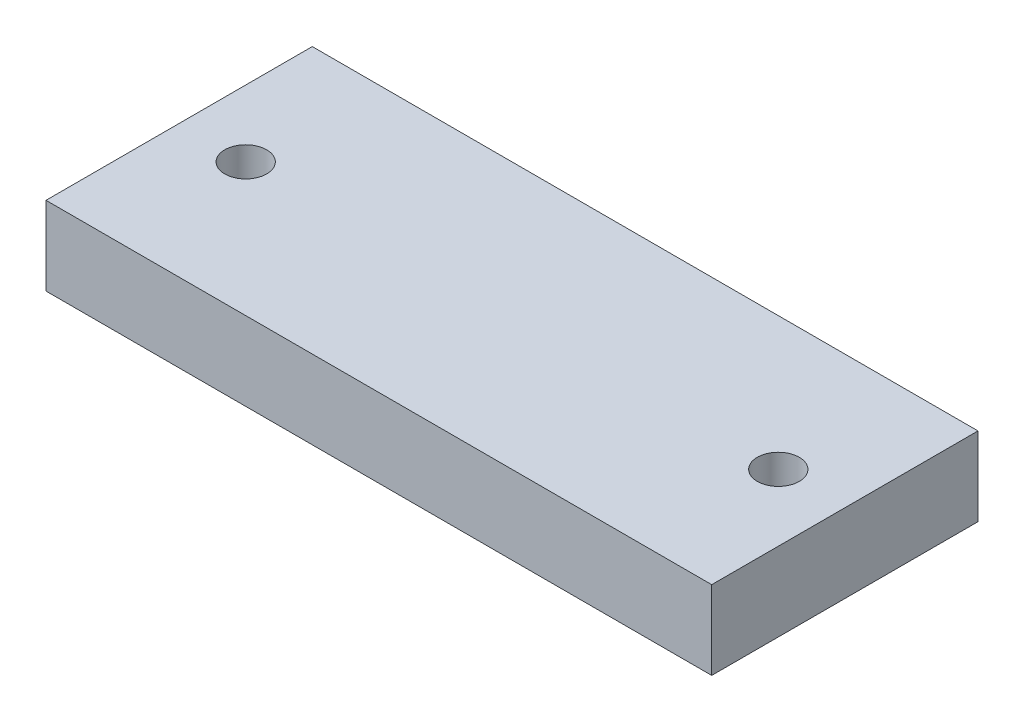
ISO-10303-21;
HEADER;
FILE_DESCRIPTION(('STEP AP214'),'2;1');
FILE_NAME('part.step','',(''),(''),'','','');
FILE_SCHEMA(('AUTOMOTIVE_DESIGN { 1 0 10303 214 1 1 1 1 }'));
ENDSEC;
DATA;
#1=APPLICATION_CONTEXT('core data for automotive mechanical design processes');
#2=APPLICATION_PROTOCOL_DEFINITION('international standard','automotive_design',2000,#1);
#3=PRODUCT_CONTEXT('',#1,'mechanical');
#4=PRODUCT('Part','Part','',(#3));
#5=PRODUCT_RELATED_PRODUCT_CATEGORY('part','',(#4));
#6=PRODUCT_DEFINITION_FORMATION('','',#4);
#7=PRODUCT_DEFINITION_CONTEXT('part definition',#1,'design');
#8=PRODUCT_DEFINITION('design','',#6,#7);
#9=PRODUCT_DEFINITION_SHAPE('','',#8);
#10=(LENGTH_UNIT() NAMED_UNIT(*) SI_UNIT(.MILLI.,.METRE.));
#11=(NAMED_UNIT(*) PLANE_ANGLE_UNIT() SI_UNIT($,.RADIAN.));
#12=(NAMED_UNIT(*) SI_UNIT($,.STERADIAN.) SOLID_ANGLE_UNIT());
#13=UNCERTAINTY_MEASURE_WITH_UNIT(LENGTH_MEASURE(1.E-05),#10,'distance_accuracy_value','');
#14=(GEOMETRIC_REPRESENTATION_CONTEXT(3) GLOBAL_UNCERTAINTY_ASSIGNED_CONTEXT((#13)) GLOBAL_UNIT_ASSIGNED_CONTEXT((#10,
#11,#12)) REPRESENTATION_CONTEXT('',''));
#15=CARTESIAN_POINT('',(0.,0.,0.));
#16=DIRECTION('',(0.,0.,1.));
#17=DIRECTION('',(1.,0.,0.));
#18=AXIS2_PLACEMENT_3D('',#15,#16,#17);
#19=CARTESIAN_POINT('',(0.,15.,0.));
#20=DIRECTION('',(0.,1.,0.));
#21=DIRECTION('',(0.,0.,1.));
#22=AXIS2_PLACEMENT_3D('',#19,#20,#21);
#23=PLANE('',#22);
#24=CARTESIAN_POINT('',(12.7,15.,25.4));
#25=DIRECTION('',(0.,1.,0.));
#26=DIRECTION('',(0.,0.,1.));
#27=AXIS2_PLACEMENT_3D('',#24,#25,#26);
#28=CIRCLE('',#27,4.);
#29=CARTESIAN_POINT('',(12.7,15.,29.4));
#30=VERTEX_POINT('',#29);
#31=EDGE_CURVE('E100',#30,#30,#28,.T.);
#32=ORIENTED_EDGE('',*,*,#31,.F.);
#33=EDGE_LOOP('',(#32));
#34=FACE_BOUND('',#33,.T.);
#35=DIRECTION('',(0.,0.,1.));
#36=VECTOR('',#35,1.);
#37=CARTESIAN_POINT('',(0.,15.,0.));
#38=LINE('',#37,#36);
#39=CARTESIAN_POINT('',(0.,15.,0.));
#40=VERTEX_POINT('',#39);
#41=CARTESIAN_POINT('',(0.,15.,50.8));
#42=VERTEX_POINT('',#41);
#43=EDGE_CURVE('E85',#40,#42,#38,.T.);
#44=ORIENTED_EDGE('',*,*,#43,.T.);
#45=DIRECTION('',(1.,0.,0.));
#46=VECTOR('',#45,1.);
#47=CARTESIAN_POINT('',(0.,15.,50.8));
#48=LINE('',#47,#46);
#49=CARTESIAN_POINT('',(127.,15.,50.8));
#50=VERTEX_POINT('',#49);
#51=EDGE_CURVE('E80',#42,#50,#48,.T.);
#52=ORIENTED_EDGE('',*,*,#51,.T.);
#53=DIRECTION('',(0.,0.,-1.));
#54=VECTOR('',#53,1.);
#55=CARTESIAN_POINT('',(127.,15.,0.));
#56=LINE('',#55,#54);
#57=CARTESIAN_POINT('',(127.,15.,0.));
#58=VERTEX_POINT('',#57);
#59=EDGE_CURVE('E83',#50,#58,#56,.T.);
#60=ORIENTED_EDGE('',*,*,#59,.T.);
#61=DIRECTION('',(-1.,0.,0.));
#62=VECTOR('',#61,1.);
#63=CARTESIAN_POINT('',(0.,15.,0.));
#64=LINE('',#63,#62);
#65=EDGE_CURVE('E50',#58,#40,#64,.T.);
#66=ORIENTED_EDGE('',*,*,#65,.T.);
#67=EDGE_LOOP('',(#44,#52,#60,#66));
#68=FACE_BOUND('',#67,.T.);
#69=CARTESIAN_POINT('',(114.3,15.,25.4));
#70=DIRECTION('',(0.,1.,0.));
#71=DIRECTION('',(0.,0.,1.));
#72=AXIS2_PLACEMENT_3D('',#69,#70,#71);
#73=CIRCLE('',#72,3.99999999999999);
#74=CARTESIAN_POINT('',(114.3,15.,29.4));
#75=VERTEX_POINT('',#74);
#76=EDGE_CURVE('E115',#75,#75,#73,.T.);
#77=ORIENTED_EDGE('',*,*,#76,.F.);
#78=EDGE_LOOP('',(#77));
#79=FACE_BOUND('',#78,.T.);
#80=ADVANCED_FACE('F33',(#34,#68,#79),#23,.T.);
#81=CARTESIAN_POINT('',(0.,0.,0.));
#82=DIRECTION('',(0.,1.,0.));
#83=DIRECTION('',(0.,0.,1.));
#84=AXIS2_PLACEMENT_3D('',#81,#82,#83);
#85=PLANE('',#84);
#86=DIRECTION('',(0.,0.,1.));
#87=VECTOR('',#86,1.);
#88=CARTESIAN_POINT('',(0.,0.,0.));
#89=LINE('',#88,#87);
#90=CARTESIAN_POINT('',(0.,0.,0.));
#91=VERTEX_POINT('',#90);
#92=CARTESIAN_POINT('',(0.,0.,50.8));
#93=VERTEX_POINT('',#92);
#94=EDGE_CURVE('E97',#91,#93,#89,.T.);
#95=ORIENTED_EDGE('',*,*,#94,.F.);
#96=DIRECTION('',(-1.,0.,0.));
#97=VECTOR('',#96,1.);
#98=CARTESIAN_POINT('',(0.,0.,0.));
#99=LINE('',#98,#97);
#100=CARTESIAN_POINT('',(127.,0.,0.));
#101=VERTEX_POINT('',#100);
#102=EDGE_CURVE('E73',#101,#91,#99,.T.);
#103=ORIENTED_EDGE('',*,*,#102,.F.);
#104=DIRECTION('',(0.,0.,-1.));
#105=VECTOR('',#104,1.);
#106=CARTESIAN_POINT('',(127.,0.,0.));
#107=LINE('',#106,#105);
#108=CARTESIAN_POINT('',(127.,0.,50.8));
#109=VERTEX_POINT('',#108);
#110=EDGE_CURVE('E67',#109,#101,#107,.T.);
#111=ORIENTED_EDGE('',*,*,#110,.F.);
#112=DIRECTION('',(1.,0.,0.));
#113=VECTOR('',#112,1.);
#114=CARTESIAN_POINT('',(0.,0.,50.8));
#115=LINE('',#114,#113);
#116=EDGE_CURVE('E89',#93,#109,#115,.T.);
#117=ORIENTED_EDGE('',*,*,#116,.F.);
#118=EDGE_LOOP('',(#95,#103,#111,#117));
#119=FACE_BOUND('',#118,.T.);
#120=CARTESIAN_POINT('',(12.7,0.,25.4));
#121=DIRECTION('',(0.,1.,0.));
#122=DIRECTION('',(0.,0.,1.));
#123=AXIS2_PLACEMENT_3D('',#120,#121,#122);
#124=CIRCLE('',#123,4.);
#125=CARTESIAN_POINT('',(12.7,0.,29.4));
#126=VERTEX_POINT('',#125);
#127=EDGE_CURVE('E112',#126,#126,#124,.T.);
#128=ORIENTED_EDGE('',*,*,#127,.T.);
#129=EDGE_LOOP('',(#128));
#130=FACE_BOUND('',#129,.T.);
#131=CARTESIAN_POINT('',(114.3,0.,25.4));
#132=DIRECTION('',(0.,1.,0.));
#133=DIRECTION('',(0.,0.,1.));
#134=AXIS2_PLACEMENT_3D('',#131,#132,#133);
#135=CIRCLE('',#134,3.99999999999999);
#136=CARTESIAN_POINT('',(114.3,0.,29.4));
#137=VERTEX_POINT('',#136);
#138=EDGE_CURVE('E118',#137,#137,#135,.T.);
#139=ORIENTED_EDGE('',*,*,#138,.T.);
#140=EDGE_LOOP('',(#139));
#141=FACE_BOUND('',#140,.T.);
#142=ADVANCED_FACE('F108',(#119,#130,#141),#85,.F.);
#143=CARTESIAN_POINT('',(0.,15.,0.));
#144=DIRECTION('',(1.,0.,0.));
#145=DIRECTION('',(0.,0.,-1.));
#146=AXIS2_PLACEMENT_3D('',#143,#144,#145);
#147=PLANE('',#146);
#148=ORIENTED_EDGE('',*,*,#94,.T.);
#149=DIRECTION('',(0.,-1.,0.));
#150=VECTOR('',#149,1.);
#151=CARTESIAN_POINT('',(0.,15.,50.8));
#152=LINE('',#151,#150);
#153=EDGE_CURVE('E11',#42,#93,#152,.T.);
#154=ORIENTED_EDGE('',*,*,#153,.F.);
#155=ORIENTED_EDGE('',*,*,#43,.F.);
#156=DIRECTION('',(0.,-1.,0.));
#157=VECTOR('',#156,1.);
#158=CARTESIAN_POINT('',(0.,15.,0.));
#159=LINE('',#158,#157);
#160=EDGE_CURVE('E93',#40,#91,#159,.T.);
#161=ORIENTED_EDGE('',*,*,#160,.T.);
#162=EDGE_LOOP('',(#148,#154,#155,#161));
#163=FACE_BOUND('',#162,.T.);
#164=ADVANCED_FACE('F35',(#163),#147,.F.);
#165=CARTESIAN_POINT('',(0.,15.,50.8));
#166=DIRECTION('',(0.,0.,-1.));
#167=DIRECTION('',(-1.,0.,0.));
#168=AXIS2_PLACEMENT_3D('',#165,#166,#167);
#169=PLANE('',#168);
#170=ORIENTED_EDGE('',*,*,#116,.T.);
#171=DIRECTION('',(0.,-1.,0.));
#172=VECTOR('',#171,1.);
#173=CARTESIAN_POINT('',(127.,15.,50.8));
#174=LINE('',#173,#172);
#175=EDGE_CURVE('E42',#50,#109,#174,.T.);
#176=ORIENTED_EDGE('',*,*,#175,.F.);
#177=ORIENTED_EDGE('',*,*,#51,.F.);
#178=ORIENTED_EDGE('',*,*,#153,.T.);
#179=EDGE_LOOP('',(#170,#176,#177,#178));
#180=FACE_BOUND('',#179,.T.);
#181=ADVANCED_FACE('F88',(#180),#169,.F.);
#182=CARTESIAN_POINT('',(127.,15.,0.));
#183=DIRECTION('',(-1.,0.,0.));
#184=DIRECTION('',(0.,0.,1.));
#185=AXIS2_PLACEMENT_3D('',#182,#183,#184);
#186=PLANE('',#185);
#187=ORIENTED_EDGE('',*,*,#110,.T.);
#188=DIRECTION('',(0.,-1.,0.));
#189=VECTOR('',#188,1.);
#190=CARTESIAN_POINT('',(127.,15.,0.));
#191=LINE('',#190,#189);
#192=EDGE_CURVE('E90',#58,#101,#191,.T.);
#193=ORIENTED_EDGE('',*,*,#192,.F.);
#194=ORIENTED_EDGE('',*,*,#59,.F.);
#195=ORIENTED_EDGE('',*,*,#175,.T.);
#196=EDGE_LOOP('',(#187,#193,#194,#195));
#197=FACE_BOUND('',#196,.T.);
#198=ADVANCED_FACE('F91',(#197),#186,.F.);
#199=CARTESIAN_POINT('',(0.,15.,0.));
#200=DIRECTION('',(0.,0.,1.));
#201=DIRECTION('',(1.,0.,0.));
#202=AXIS2_PLACEMENT_3D('',#199,#200,#201);
#203=PLANE('',#202);
#204=ORIENTED_EDGE('',*,*,#102,.T.);
#205=ORIENTED_EDGE('',*,*,#160,.F.);
#206=ORIENTED_EDGE('',*,*,#65,.F.);
#207=ORIENTED_EDGE('',*,*,#192,.T.);
#208=EDGE_LOOP('',(#204,#205,#206,#207));
#209=FACE_BOUND('',#208,.T.);
#210=ADVANCED_FACE('F105',(#209),#203,.F.);
#211=CARTESIAN_POINT('',(12.7,15.,25.4));
#212=DIRECTION('',(0.,-1.,0.));
#213=DIRECTION('',(0.,0.,-1.));
#214=AXIS2_PLACEMENT_3D('',#211,#212,#213);
#215=CYLINDRICAL_SURFACE('',#214,4.);
#216=ORIENTED_EDGE('',*,*,#31,.T.);
#217=EDGE_LOOP('',(#216));
#218=FACE_BOUND('',#217,.T.);
#219=ORIENTED_EDGE('',*,*,#127,.F.);
#220=EDGE_LOOP('',(#219));
#221=FACE_BOUND('',#220,.T.);
#222=ADVANCED_FACE('F135',(#218,#221),#215,.F.);
#223=CARTESIAN_POINT('',(114.3,15.,25.4));
#224=DIRECTION('',(0.,-1.,0.));
#225=DIRECTION('',(0.,0.,-1.));
#226=AXIS2_PLACEMENT_3D('',#223,#224,#225);
#227=CYLINDRICAL_SURFACE('',#226,3.99999999999999);
#228=ORIENTED_EDGE('',*,*,#76,.T.);
#229=EDGE_LOOP('',(#228));
#230=FACE_BOUND('',#229,.T.);
#231=ORIENTED_EDGE('',*,*,#138,.F.);
#232=EDGE_LOOP('',(#231));
#233=FACE_BOUND('',#232,.T.);
#234=ADVANCED_FACE('F124',(#230,#233),#227,.F.);
#235=CLOSED_SHELL('',(#80,#142,#164,#181,#198,#210,#222,#234));
#236=MANIFOLD_SOLID_BREP('B2',#235);
#237=ADVANCED_BREP_SHAPE_REPRESENTATION('',(#18,#236),#14);
#238=SHAPE_DEFINITION_REPRESENTATION(#9,#237);
ENDSEC;
END-ISO-10303-21;
